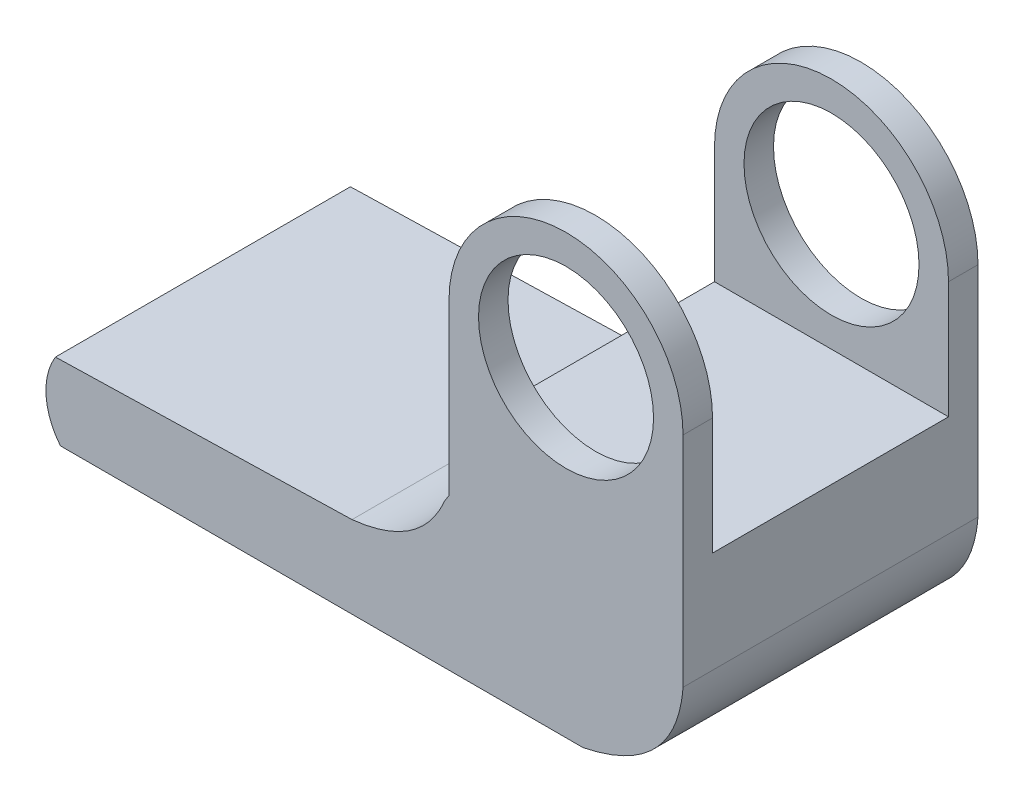
ISO-10303-21;
HEADER;
FILE_DESCRIPTION(('STEP AP214'),'2;1');
FILE_NAME('part.step','',(''),(''),'','','');
FILE_SCHEMA(('AUTOMOTIVE_DESIGN { 1 0 10303 214 1 1 1 1 }'));
ENDSEC;
DATA;
#1=APPLICATION_CONTEXT('core data for automotive mechanical design processes');
#2=APPLICATION_PROTOCOL_DEFINITION('international standard','automotive_design',2000,#1);
#3=PRODUCT_CONTEXT('',#1,'mechanical');
#4=PRODUCT('Part','Part','',(#3));
#5=PRODUCT_RELATED_PRODUCT_CATEGORY('part','',(#4));
#6=PRODUCT_DEFINITION_FORMATION('','',#4);
#7=PRODUCT_DEFINITION_CONTEXT('part definition',#1,'design');
#8=PRODUCT_DEFINITION('design','',#6,#7);
#9=PRODUCT_DEFINITION_SHAPE('','',#8);
#10=(LENGTH_UNIT() NAMED_UNIT(*) SI_UNIT(.MILLI.,.METRE.));
#11=(NAMED_UNIT(*) PLANE_ANGLE_UNIT() SI_UNIT($,.RADIAN.));
#12=(NAMED_UNIT(*) SI_UNIT($,.STERADIAN.) SOLID_ANGLE_UNIT());
#13=UNCERTAINTY_MEASURE_WITH_UNIT(LENGTH_MEASURE(1.E-05),#10,'distance_accuracy_value','');
#14=(GEOMETRIC_REPRESENTATION_CONTEXT(3) GLOBAL_UNCERTAINTY_ASSIGNED_CONTEXT((#13)) GLOBAL_UNIT_ASSIGNED_CONTEXT((#10,
#11,#12)) REPRESENTATION_CONTEXT('',''));
#15=CARTESIAN_POINT('',(0.,0.,0.));
#16=DIRECTION('',(0.,0.,1.));
#17=DIRECTION('',(1.,0.,0.));
#18=AXIS2_PLACEMENT_3D('',#15,#16,#17);
#19=CARTESIAN_POINT('',(0.,0.,30.));
#20=DIRECTION('',(0.,0.,-1.));
#21=DIRECTION('',(-1.,0.,0.));
#22=AXIS2_PLACEMENT_3D('',#19,#20,#21);
#23=CYLINDRICAL_SURFACE('',#22,11.9);
#24=DIRECTION('',(0.,0.,-1.));
#25=VECTOR('',#24,1.);
#26=CARTESIAN_POINT('',(-11.9,0.,30.));
#27=LINE('',#26,#25);
#28=CARTESIAN_POINT('',(-11.9,0.,3.));
#29=VERTEX_POINT('',#28);
#30=CARTESIAN_POINT('',(-11.9,0.,0.));
#31=VERTEX_POINT('',#30);
#32=EDGE_CURVE('E147',#29,#31,#27,.T.);
#33=ORIENTED_EDGE('',*,*,#32,.F.);
#34=CARTESIAN_POINT('',(0.,0.,3.));
#35=DIRECTION('',(0.,0.,-1.));
#36=DIRECTION('',(-1.,0.,0.));
#37=AXIS2_PLACEMENT_3D('',#34,#35,#36);
#38=CIRCLE('',#37,11.9);
#39=CARTESIAN_POINT('',(11.9,0.,3.));
#40=VERTEX_POINT('',#39);
#41=EDGE_CURVE('E166',#29,#40,#38,.T.);
#42=ORIENTED_EDGE('',*,*,#41,.T.);
#43=DIRECTION('',(0.,0.,-1.));
#44=VECTOR('',#43,1.);
#45=CARTESIAN_POINT('',(11.9,0.,30.));
#46=LINE('',#45,#44);
#47=CARTESIAN_POINT('',(11.9,0.,0.));
#48=VERTEX_POINT('',#47);
#49=EDGE_CURVE('E146',#40,#48,#46,.T.);
#50=ORIENTED_EDGE('',*,*,#49,.T.);
#51=CARTESIAN_POINT('',(0.,0.,0.));
#52=DIRECTION('',(0.,0.,1.));
#53=DIRECTION('',(1.,0.,0.));
#54=AXIS2_PLACEMENT_3D('',#51,#52,#53);
#55=CIRCLE('',#54,11.9);
#56=EDGE_CURVE('E185',#48,#31,#55,.T.);
#57=ORIENTED_EDGE('',*,*,#56,.T.);
#58=EDGE_LOOP('',(#33,#42,#50,#57));
#59=FACE_BOUND('',#58,.T.);
#60=ADVANCED_FACE('F37',(#59),#23,.T.);
#61=CARTESIAN_POINT('',(0.,0.,30.));
#62=DIRECTION('',(0.,0.,-1.));
#63=DIRECTION('',(-1.,0.,0.));
#64=AXIS2_PLACEMENT_3D('',#61,#62,#63);
#65=CYLINDRICAL_SURFACE('',#64,8.9);
#66=CARTESIAN_POINT('',(0.,0.,3.));
#67=DIRECTION('',(0.,0.,-1.));
#68=DIRECTION('',(-1.,0.,0.));
#69=AXIS2_PLACEMENT_3D('',#66,#67,#68);
#70=CIRCLE('',#69,8.9);
#71=CARTESIAN_POINT('',(-8.9,0.,3.));
#72=VERTEX_POINT('',#71);
#73=EDGE_CURVE('E42',#72,#72,#70,.T.);
#74=ORIENTED_EDGE('',*,*,#73,.F.);
#75=EDGE_LOOP('',(#74));
#76=FACE_BOUND('',#75,.T.);
#77=CARTESIAN_POINT('',(0.,0.,0.));
#78=DIRECTION('',(0.,0.,1.));
#79=DIRECTION('',(1.,0.,0.));
#80=AXIS2_PLACEMENT_3D('',#77,#78,#79);
#81=CIRCLE('',#80,8.9);
#82=CARTESIAN_POINT('',(8.9,0.,0.));
#83=VERTEX_POINT('',#82);
#84=EDGE_CURVE('E192',#83,#83,#81,.T.);
#85=ORIENTED_EDGE('',*,*,#84,.F.);
#86=EDGE_LOOP('',(#85));
#87=FACE_BOUND('',#86,.T.);
#88=ADVANCED_FACE('F269',(#76,#87),#65,.F.);
#89=CARTESIAN_POINT('',(-21.7645594127518,-24.2844513499065,30.));
#90=CARTESIAN_POINT('',(-14.0586027858104,-23.4565450214434,30.));
#91=CARTESIAN_POINT('',(-11.9,-16.752702019937,30.));
#92=B_SPLINE_CURVE_WITH_KNOTS('',2,(#89,#90,#91),.UNSPECIFIED.,.F.,.F.,(3,3),(0.,1.),.UNSPECIFIED.);
#93=DIRECTION('',(0.,0.,-1.));
#94=VECTOR('',#93,1.);
#95=SURFACE_OF_LINEAR_EXTRUSION('',#92,#94);
#96=CARTESIAN_POINT('',(-21.7645594127518,-24.2844513499065,0.));
#97=CARTESIAN_POINT('',(-14.0586027858104,-23.4565450214434,0.));
#98=CARTESIAN_POINT('',(-11.9,-16.752702019937,0.));
#99=B_SPLINE_CURVE_WITH_KNOTS('',2,(#96,#97,#98),.UNSPECIFIED.,.F.,.F.,(3,3),(0.,1.),.UNSPECIFIED.);
#100=CARTESIAN_POINT('',(-21.7645594127518,-24.2844513499065,0.));
#101=VERTEX_POINT('',#100);
#102=CARTESIAN_POINT('',(-12.3014073673496,-17.8365877125342,0.));
#103=VERTEX_POINT('',#102);
#104=EDGE_CURVE('E160',#101,#103,#99,.T.);
#105=ORIENTED_EDGE('',*,*,#104,.F.);
#106=DIRECTION('',(0.,0.,-1.));
#107=VECTOR('',#106,1.);
#108=CARTESIAN_POINT('',(-21.7645594127518,-24.2844513499065,30.));
#109=LINE('',#108,#107);
#110=CARTESIAN_POINT('',(-21.7645594127518,-24.2844513499065,30.));
#111=VERTEX_POINT('',#110);
#112=EDGE_CURVE('E11',#111,#101,#109,.T.);
#113=ORIENTED_EDGE('',*,*,#112,.F.);
#114=CARTESIAN_POINT('',(-12.3014073673496,-17.8365877125342,30.));
#115=VERTEX_POINT('',#114);
#116=EDGE_CURVE('E195',#111,#115,#92,.T.);
#117=ORIENTED_EDGE('',*,*,#116,.T.);
#118=DIRECTION('',(0.,0.,-1.));
#119=VECTOR('',#118,1.);
#120=CARTESIAN_POINT('',(-12.3014073673496,-17.8365877125342,30.));
#121=LINE('',#120,#119);
#122=EDGE_CURVE('E99',#115,#103,#121,.T.);
#123=ORIENTED_EDGE('',*,*,#122,.T.);
#124=EDGE_LOOP('',(#105,#113,#117,#123));
#125=FACE_BOUND('',#124,.T.);
#126=ADVANCED_FACE('F39',(#125),#95,.T.);
#127=CARTESIAN_POINT('',(0.601600853316531,-23.7171184710017,30.));
#128=DIRECTION('',(0.0253575242313666,-0.999678446284032,0.));
#129=DIRECTION('',(0.999678446284032,0.0253575242313666,0.));
#130=AXIS2_PLACEMENT_3D('',#127,#128,#129);
#131=PLANE('',#130);
#132=DIRECTION('',(-0.999678446284032,-0.0253575242313666,0.));
#133=VECTOR('',#132,1.);
#134=CARTESIAN_POINT('',(0.601600853316531,-23.7171184710017,0.));
#135=LINE('',#134,#133);
#136=CARTESIAN_POINT('',(-51.9305873013289,-25.0496331801161,0.));
#137=VERTEX_POINT('',#136);
#138=EDGE_CURVE('E165',#101,#137,#135,.T.);
#139=ORIENTED_EDGE('',*,*,#138,.T.);
#140=DIRECTION('',(0.,0.,-1.));
#141=VECTOR('',#140,1.);
#142=CARTESIAN_POINT('',(-51.9305873013289,-25.0496331801161,30.));
#143=LINE('',#142,#141);
#144=CARTESIAN_POINT('',(-51.9305873013289,-25.0496331801161,30.));
#145=VERTEX_POINT('',#144);
#146=EDGE_CURVE('E47',#145,#137,#143,.T.);
#147=ORIENTED_EDGE('',*,*,#146,.F.);
#148=DIRECTION('',(-0.999678446284032,-0.0253575242313666,0.));
#149=VECTOR('',#148,1.);
#150=CARTESIAN_POINT('',(0.601600853316531,-23.7171184710017,30.));
#151=LINE('',#150,#149);
#152=EDGE_CURVE('E232',#111,#145,#151,.T.);
#153=ORIENTED_EDGE('',*,*,#152,.F.);
#154=ORIENTED_EDGE('',*,*,#112,.T.);
#155=EDGE_LOOP('',(#139,#147,#153,#154));
#156=FACE_BOUND('',#155,.T.);
#157=ADVANCED_FACE('F262',(#156),#131,.F.);
#158=CARTESIAN_POINT('',(-46.3597623618444,-28.4779514302989,30.));
#159=DIRECTION('',(0.,0.,-1.));
#160=DIRECTION('',(-1.,0.,0.));
#161=AXIS2_PLACEMENT_3D('',#158,#159,#160);
#162=CYLINDRICAL_SURFACE('',#161,6.54121216067175);
#163=CARTESIAN_POINT('',(-46.3597623618444,-28.4779514302989,0.));
#164=DIRECTION('',(0.,0.,1.));
#165=DIRECTION('',(1.,0.,0.));
#166=AXIS2_PLACEMENT_3D('',#163,#164,#165);
#167=CIRCLE('',#166,6.54121216067175);
#168=CARTESIAN_POINT('',(-51.4206946338311,-32.6221547396557,0.));
#169=VERTEX_POINT('',#168);
#170=EDGE_CURVE('E171',#137,#169,#167,.T.);
#171=ORIENTED_EDGE('',*,*,#170,.T.);
#172=DIRECTION('',(0.,0.,-1.));
#173=VECTOR('',#172,1.);
#174=CARTESIAN_POINT('',(-51.4206946338311,-32.6221547396557,30.));
#175=LINE('',#174,#173);
#176=CARTESIAN_POINT('',(-51.4206946338311,-32.6221547396557,30.));
#177=VERTEX_POINT('',#176);
#178=EDGE_CURVE('E206',#177,#169,#175,.T.);
#179=ORIENTED_EDGE('',*,*,#178,.F.);
#180=CARTESIAN_POINT('',(-46.3597623618444,-28.4779514302989,30.));
#181=DIRECTION('',(0.,0.,1.));
#182=DIRECTION('',(1.,0.,0.));
#183=AXIS2_PLACEMENT_3D('',#180,#181,#182);
#184=CIRCLE('',#183,6.54121216067175);
#185=EDGE_CURVE('E237',#145,#177,#184,.T.);
#186=ORIENTED_EDGE('',*,*,#185,.F.);
#187=ORIENTED_EDGE('',*,*,#146,.T.);
#188=EDGE_LOOP('',(#171,#179,#186,#187));
#189=FACE_BOUND('',#188,.T.);
#190=ADVANCED_FACE('F259',(#189),#162,.T.);
#191=CARTESIAN_POINT('',(0.,-32.6221547396557,30.));
#192=DIRECTION('',(0.,1.,0.));
#193=DIRECTION('',(0.,0.,1.));
#194=AXIS2_PLACEMENT_3D('',#191,#192,#193);
#195=PLANE('',#194);
#196=DIRECTION('',(1.,0.,0.));
#197=VECTOR('',#196,1.);
#198=CARTESIAN_POINT('',(0.,-32.6221547396557,0.));
#199=LINE('',#198,#197);
#200=CARTESIAN_POINT('',(1.73224006381655,-32.6221547396557,0.));
#201=VERTEX_POINT('',#200);
#202=EDGE_CURVE('E173',#169,#201,#199,.T.);
#203=ORIENTED_EDGE('',*,*,#202,.T.);
#204=DIRECTION('',(0.,0.,-1.));
#205=VECTOR('',#204,1.);
#206=CARTESIAN_POINT('',(1.73224006381655,-32.6221547396557,30.));
#207=LINE('',#206,#205);
#208=CARTESIAN_POINT('',(1.73224006381655,-32.6221547396557,30.));
#209=VERTEX_POINT('',#208);
#210=EDGE_CURVE('E203',#209,#201,#207,.T.);
#211=ORIENTED_EDGE('',*,*,#210,.F.);
#212=DIRECTION('',(1.,0.,0.));
#213=VECTOR('',#212,1.);
#214=CARTESIAN_POINT('',(0.,-32.6221547396557,30.));
#215=LINE('',#214,#213);
#216=EDGE_CURVE('E239',#177,#209,#215,.T.);
#217=ORIENTED_EDGE('',*,*,#216,.F.);
#218=ORIENTED_EDGE('',*,*,#178,.T.);
#219=EDGE_LOOP('',(#203,#211,#217,#218));
#220=FACE_BOUND('',#219,.T.);
#221=ADVANCED_FACE('F254',(#220),#195,.F.);
#222=CARTESIAN_POINT('',(1.73224006381655,-32.6221547396557,30.));
#223=CARTESIAN_POINT('',(11.2481659514987,-30.6652305951302,30.));
#224=CARTESIAN_POINT('',(11.9,-22.2212723525973,30.));
#225=B_SPLINE_CURVE_WITH_KNOTS('',2,(#222,#223,#224),.UNSPECIFIED.,.F.,.F.,(3,3),(0.,1.),.UNSPECIFIED.);
#226=DIRECTION('',(0.,0.,-1.));
#227=VECTOR('',#226,1.);
#228=SURFACE_OF_LINEAR_EXTRUSION('',#225,#227);
#229=CARTESIAN_POINT('',(1.73224006381655,-32.6221547396557,0.));
#230=CARTESIAN_POINT('',(11.2481659514987,-30.6652305951302,0.));
#231=CARTESIAN_POINT('',(11.9,-22.2212723525973,0.));
#232=B_SPLINE_CURVE_WITH_KNOTS('',2,(#229,#230,#231),.UNSPECIFIED.,.F.,.F.,(3,3),(0.,1.),.UNSPECIFIED.);
#233=CARTESIAN_POINT('',(11.9,-22.2212723525973,0.));
#234=VERTEX_POINT('',#233);
#235=EDGE_CURVE('E175',#201,#234,#232,.T.);
#236=ORIENTED_EDGE('',*,*,#235,.T.);
#237=DIRECTION('',(0.,0.,-1.));
#238=VECTOR('',#237,1.);
#239=CARTESIAN_POINT('',(11.9,-22.2212723525973,30.));
#240=LINE('',#239,#238);
#241=CARTESIAN_POINT('',(11.9,-22.2212723525973,30.));
#242=VERTEX_POINT('',#241);
#243=EDGE_CURVE('E200',#242,#234,#240,.T.);
#244=ORIENTED_EDGE('',*,*,#243,.F.);
#245=EDGE_CURVE('E241',#209,#242,#225,.T.);
#246=ORIENTED_EDGE('',*,*,#245,.F.);
#247=ORIENTED_EDGE('',*,*,#210,.T.);
#248=EDGE_LOOP('',(#236,#244,#246,#247));
#249=FACE_BOUND('',#248,.T.);
#250=ADVANCED_FACE('F249',(#249),#228,.F.);
#251=CARTESIAN_POINT('',(11.9,0.,30.));
#252=DIRECTION('',(-1.,0.,0.));
#253=DIRECTION('',(0.,-1.,0.));
#254=AXIS2_PLACEMENT_3D('',#251,#252,#253);
#255=PLANE('',#254);
#256=ORIENTED_EDGE('',*,*,#49,.F.);
#257=DIRECTION('',(0.,1.,0.));
#258=VECTOR('',#257,1.);
#259=CARTESIAN_POINT('',(11.9,-11.9,3.));
#260=LINE('',#259,#258);
#261=CARTESIAN_POINT('',(11.9,-11.9,3.));
#262=VERTEX_POINT('',#261);
#263=EDGE_CURVE('E216',#262,#40,#260,.T.);
#264=ORIENTED_EDGE('',*,*,#263,.F.);
#265=DIRECTION('',(0.,0.,-1.));
#266=VECTOR('',#265,1.);
#267=CARTESIAN_POINT('',(11.9,-11.9,3.));
#268=LINE('',#267,#266);
#269=CARTESIAN_POINT('',(11.9,-11.9,27.));
#270=VERTEX_POINT('',#269);
#271=EDGE_CURVE('E212',#270,#262,#268,.T.);
#272=ORIENTED_EDGE('',*,*,#271,.F.);
#273=DIRECTION('',(0.,-1.,0.));
#274=VECTOR('',#273,1.);
#275=CARTESIAN_POINT('',(11.9,-11.9,27.));
#276=LINE('',#275,#274);
#277=CARTESIAN_POINT('',(11.9,0.,27.));
#278=VERTEX_POINT('',#277);
#279=EDGE_CURVE('E222',#278,#270,#276,.T.);
#280=ORIENTED_EDGE('',*,*,#279,.F.);
#281=CARTESIAN_POINT('',(11.9,0.,30.));
#282=VERTEX_POINT('',#281);
#283=EDGE_CURVE('E198',#282,#278,#46,.T.);
#284=ORIENTED_EDGE('',*,*,#283,.F.);
#285=DIRECTION('',(0.,1.,0.));
#286=VECTOR('',#285,1.);
#287=CARTESIAN_POINT('',(11.9,0.,30.));
#288=LINE('',#287,#286);
#289=EDGE_CURVE('E131',#242,#282,#288,.T.);
#290=ORIENTED_EDGE('',*,*,#289,.F.);
#291=ORIENTED_EDGE('',*,*,#243,.T.);
#292=DIRECTION('',(0.,1.,0.));
#293=VECTOR('',#292,1.);
#294=CARTESIAN_POINT('',(11.9,0.,0.));
#295=LINE('',#294,#293);
#296=EDGE_CURVE('E179',#234,#48,#295,.T.);
#297=ORIENTED_EDGE('',*,*,#296,.T.);
#298=EDGE_LOOP('',(#256,#264,#272,#280,#284,#290,#291,#297));
#299=FACE_BOUND('',#298,.T.);
#300=ADVANCED_FACE('F253',(#299),#255,.F.);
#301=ORIENTED_EDGE('',*,*,#283,.T.);
#302=CARTESIAN_POINT('',(0.,0.,27.));
#303=DIRECTION('',(0.,0.,1.));
#304=DIRECTION('',(1.,0.,0.));
#305=AXIS2_PLACEMENT_3D('',#302,#303,#304);
#306=CIRCLE('',#305,11.9);
#307=CARTESIAN_POINT('',(-11.9,0.,27.));
#308=VERTEX_POINT('',#307);
#309=EDGE_CURVE('E142',#278,#308,#306,.T.);
#310=ORIENTED_EDGE('',*,*,#309,.T.);
#311=CARTESIAN_POINT('',(-11.9,0.,30.));
#312=VERTEX_POINT('',#311);
#313=EDGE_CURVE('E138',#312,#308,#27,.T.);
#314=ORIENTED_EDGE('',*,*,#313,.F.);
#315=CARTESIAN_POINT('',(0.,0.,30.));
#316=DIRECTION('',(0.,0.,1.));
#317=DIRECTION('',(1.,0.,0.));
#318=AXIS2_PLACEMENT_3D('',#315,#316,#317);
#319=CIRCLE('',#318,11.9);
#320=EDGE_CURVE('E123',#282,#312,#319,.T.);
#321=ORIENTED_EDGE('',*,*,#320,.F.);
#322=EDGE_LOOP('',(#301,#310,#314,#321));
#323=FACE_BOUND('',#322,.T.);
#324=ADVANCED_FACE('F139',(#323),#23,.T.);
#325=CARTESIAN_POINT('',(-11.9,0.,30.));
#326=DIRECTION('',(1.,0.,0.));
#327=DIRECTION('',(0.,1.,0.));
#328=AXIS2_PLACEMENT_3D('',#325,#326,#327);
#329=PLANE('',#328);
#330=DIRECTION('',(0.,0.,1.));
#331=VECTOR('',#330,1.);
#332=CARTESIAN_POINT('',(-11.9,-11.9,3.));
#333=LINE('',#332,#331);
#334=CARTESIAN_POINT('',(-11.9,-11.9,3.));
#335=VERTEX_POINT('',#334);
#336=CARTESIAN_POINT('',(-11.9,-11.9,27.));
#337=VERTEX_POINT('',#336);
#338=EDGE_CURVE('E306',#335,#337,#333,.T.);
#339=ORIENTED_EDGE('',*,*,#338,.F.);
#340=DIRECTION('',(0.,-1.,0.));
#341=VECTOR('',#340,1.);
#342=CARTESIAN_POINT('',(-11.9,-11.9,3.));
#343=LINE('',#342,#341);
#344=EDGE_CURVE('E299',#29,#335,#343,.T.);
#345=ORIENTED_EDGE('',*,*,#344,.F.);
#346=ORIENTED_EDGE('',*,*,#32,.T.);
#347=DIRECTION('',(0.,-1.,0.));
#348=VECTOR('',#347,1.);
#349=CARTESIAN_POINT('',(-11.9,0.,0.));
#350=LINE('',#349,#348);
#351=CARTESIAN_POINT('',(-11.9,-17.2545618107506,0.));
#352=VERTEX_POINT('',#351);
#353=EDGE_CURVE('E188',#31,#352,#350,.T.);
#354=ORIENTED_EDGE('',*,*,#353,.T.);
#355=DIRECTION('',(0.,0.,-1.));
#356=VECTOR('',#355,1.);
#357=CARTESIAN_POINT('',(-11.9,-17.2545618107506,30.));
#358=LINE('',#357,#356);
#359=CARTESIAN_POINT('',(-11.9,-17.2545618107506,30.));
#360=VERTEX_POINT('',#359);
#361=EDGE_CURVE('E152',#360,#352,#358,.T.);
#362=ORIENTED_EDGE('',*,*,#361,.F.);
#363=DIRECTION('',(0.,-1.,0.));
#364=VECTOR('',#363,1.);
#365=CARTESIAN_POINT('',(-11.9,0.,30.));
#366=LINE('',#365,#364);
#367=EDGE_CURVE('E128',#312,#360,#366,.T.);
#368=ORIENTED_EDGE('',*,*,#367,.F.);
#369=ORIENTED_EDGE('',*,*,#313,.T.);
#370=DIRECTION('',(0.,1.,0.));
#371=VECTOR('',#370,1.);
#372=CARTESIAN_POINT('',(-11.9,-11.9,27.));
#373=LINE('',#372,#371);
#374=EDGE_CURVE('E304',#337,#308,#373,.T.);
#375=ORIENTED_EDGE('',*,*,#374,.F.);
#376=EDGE_LOOP('',(#339,#345,#346,#354,#362,#368,#369,#375));
#377=FACE_BOUND('',#376,.T.);
#378=ADVANCED_FACE('F150',(#377),#329,.F.);
#379=CARTESIAN_POINT('',(0.,0.,30.));
#380=DIRECTION('',(0.823206047492108,-0.567742726393233,0.));
#381=DIRECTION('',(0.567742726393233,0.823206047492108,0.));
#382=AXIS2_PLACEMENT_3D('',#379,#380,#381);
#383=PLANE('',#382);
#384=DIRECTION('',(-0.567742726393233,-0.823206047492108,0.));
#385=VECTOR('',#384,1.);
#386=CARTESIAN_POINT('',(0.,0.,0.));
#387=LINE('',#386,#385);
#388=EDGE_CURVE('E190',#352,#103,#387,.T.);
#389=ORIENTED_EDGE('',*,*,#388,.T.);
#390=ORIENTED_EDGE('',*,*,#122,.F.);
#391=DIRECTION('',(-0.567742726393233,-0.823206047492108,0.));
#392=VECTOR('',#391,1.);
#393=CARTESIAN_POINT('',(0.,0.,30.));
#394=LINE('',#393,#392);
#395=EDGE_CURVE('E64',#360,#115,#394,.T.);
#396=ORIENTED_EDGE('',*,*,#395,.F.);
#397=ORIENTED_EDGE('',*,*,#361,.T.);
#398=EDGE_LOOP('',(#389,#390,#396,#397));
#399=FACE_BOUND('',#398,.T.);
#400=ADVANCED_FACE('F285',(#399),#383,.F.);
#401=CARTESIAN_POINT('',(0.,0.,27.));
#402=DIRECTION('',(0.,0.,1.));
#403=DIRECTION('',(1.,0.,0.));
#404=AXIS2_PLACEMENT_3D('',#401,#402,#403);
#405=CIRCLE('',#404,8.9);
#406=CARTESIAN_POINT('',(8.9,0.,27.));
#407=VERTEX_POINT('',#406);
#408=EDGE_CURVE('E210',#407,#407,#405,.T.);
#409=ORIENTED_EDGE('',*,*,#408,.F.);
#410=EDGE_LOOP('',(#409));
#411=FACE_BOUND('',#410,.T.);
#412=CARTESIAN_POINT('',(0.,0.,30.));
#413=DIRECTION('',(0.,0.,1.));
#414=DIRECTION('',(1.,0.,0.));
#415=AXIS2_PLACEMENT_3D('',#412,#413,#414);
#416=CIRCLE('',#415,8.9);
#417=CARTESIAN_POINT('',(8.9,0.,30.));
#418=VERTEX_POINT('',#417);
#419=EDGE_CURVE('E154',#418,#418,#416,.T.);
#420=ORIENTED_EDGE('',*,*,#419,.T.);
#421=EDGE_LOOP('',(#420));
#422=FACE_BOUND('',#421,.T.);
#423=ADVANCED_FACE('F277',(#411,#422),#65,.F.);
#424=CARTESIAN_POINT('',(0.,0.,30.));
#425=DIRECTION('',(0.,0.,1.));
#426=DIRECTION('',(1.,0.,0.));
#427=AXIS2_PLACEMENT_3D('',#424,#425,#426);
#428=PLANE('',#427);
#429=ORIENTED_EDGE('',*,*,#116,.F.);
#430=ORIENTED_EDGE('',*,*,#152,.T.);
#431=ORIENTED_EDGE('',*,*,#185,.T.);
#432=ORIENTED_EDGE('',*,*,#216,.T.);
#433=ORIENTED_EDGE('',*,*,#245,.T.);
#434=ORIENTED_EDGE('',*,*,#289,.T.);
#435=ORIENTED_EDGE('',*,*,#320,.T.);
#436=ORIENTED_EDGE('',*,*,#367,.T.);
#437=ORIENTED_EDGE('',*,*,#395,.T.);
#438=EDGE_LOOP('',(#429,#430,#431,#432,#433,#434,#435,#436,#437));
#439=FACE_BOUND('',#438,.T.);
#440=ORIENTED_EDGE('',*,*,#419,.F.);
#441=EDGE_LOOP('',(#440));
#442=FACE_BOUND('',#441,.T.);
#443=ADVANCED_FACE('F125',(#439,#442),#428,.T.);
#444=CARTESIAN_POINT('',(0.,0.,0.));
#445=DIRECTION('',(0.,0.,1.));
#446=DIRECTION('',(1.,0.,0.));
#447=AXIS2_PLACEMENT_3D('',#444,#445,#446);
#448=PLANE('',#447);
#449=ORIENTED_EDGE('',*,*,#104,.T.);
#450=ORIENTED_EDGE('',*,*,#388,.F.);
#451=ORIENTED_EDGE('',*,*,#353,.F.);
#452=ORIENTED_EDGE('',*,*,#56,.F.);
#453=ORIENTED_EDGE('',*,*,#296,.F.);
#454=ORIENTED_EDGE('',*,*,#235,.F.);
#455=ORIENTED_EDGE('',*,*,#202,.F.);
#456=ORIENTED_EDGE('',*,*,#170,.F.);
#457=ORIENTED_EDGE('',*,*,#138,.F.);
#458=EDGE_LOOP('',(#449,#450,#451,#452,#453,#454,#455,#456,#457));
#459=FACE_BOUND('',#458,.T.);
#460=ORIENTED_EDGE('',*,*,#84,.T.);
#461=EDGE_LOOP('',(#460));
#462=FACE_BOUND('',#461,.T.);
#463=ADVANCED_FACE('F322',(#459,#462),#448,.F.);
#464=CARTESIAN_POINT('',(45.7,-11.9,3.));
#465=DIRECTION('',(0.,0.,-1.));
#466=DIRECTION('',(-1.,0.,0.));
#467=AXIS2_PLACEMENT_3D('',#464,#465,#466);
#468=PLANE('',#467);
#469=ORIENTED_EDGE('',*,*,#73,.T.);
#470=EDGE_LOOP('',(#469));
#471=FACE_BOUND('',#470,.T.);
#472=ORIENTED_EDGE('',*,*,#344,.T.);
#473=DIRECTION('',(-1.,0.,0.));
#474=VECTOR('',#473,1.);
#475=CARTESIAN_POINT('',(45.7,-11.9,3.));
#476=LINE('',#475,#474);
#477=EDGE_CURVE('E55',#262,#335,#476,.T.);
#478=ORIENTED_EDGE('',*,*,#477,.F.);
#479=ORIENTED_EDGE('',*,*,#263,.T.);
#480=ORIENTED_EDGE('',*,*,#41,.F.);
#481=EDGE_LOOP('',(#472,#478,#479,#480));
#482=FACE_BOUND('',#481,.T.);
#483=ADVANCED_FACE('F298',(#471,#482),#468,.F.);
#484=CARTESIAN_POINT('',(45.7,-11.9,27.));
#485=DIRECTION('',(0.,0.,1.));
#486=DIRECTION('',(1.,0.,0.));
#487=AXIS2_PLACEMENT_3D('',#484,#485,#486);
#488=PLANE('',#487);
#489=ORIENTED_EDGE('',*,*,#408,.T.);
#490=EDGE_LOOP('',(#489));
#491=FACE_BOUND('',#490,.T.);
#492=ORIENTED_EDGE('',*,*,#279,.T.);
#493=DIRECTION('',(-1.,0.,0.));
#494=VECTOR('',#493,1.);
#495=CARTESIAN_POINT('',(45.7,-11.9,27.));
#496=LINE('',#495,#494);
#497=EDGE_CURVE('E303',#270,#337,#496,.T.);
#498=ORIENTED_EDGE('',*,*,#497,.T.);
#499=ORIENTED_EDGE('',*,*,#374,.T.);
#500=ORIENTED_EDGE('',*,*,#309,.F.);
#501=EDGE_LOOP('',(#492,#498,#499,#500));
#502=FACE_BOUND('',#501,.T.);
#503=ADVANCED_FACE('F314',(#491,#502),#488,.F.);
#504=CARTESIAN_POINT('',(45.7,-11.9,3.));
#505=DIRECTION('',(0.,-1.,0.));
#506=DIRECTION('',(1.,0.,0.));
#507=AXIS2_PLACEMENT_3D('',#504,#505,#506);
#508=PLANE('',#507);
#509=ORIENTED_EDGE('',*,*,#271,.T.);
#510=ORIENTED_EDGE('',*,*,#477,.T.);
#511=ORIENTED_EDGE('',*,*,#338,.T.);
#512=ORIENTED_EDGE('',*,*,#497,.F.);
#513=EDGE_LOOP('',(#509,#510,#511,#512));
#514=FACE_BOUND('',#513,.T.);
#515=ADVANCED_FACE('F317',(#514),#508,.F.);
#516=CLOSED_SHELL('',(#60,#88,#126,#157,#190,#221,#250,#300,#324,#378,#400,#423,#443,#463,#483,
#503,#515));
#517=MANIFOLD_SOLID_BREP('B2',#516);
#518=ADVANCED_BREP_SHAPE_REPRESENTATION('',(#18,#517),#14);
#519=SHAPE_DEFINITION_REPRESENTATION(#9,#518);
ENDSEC;
END-ISO-10303-21;
